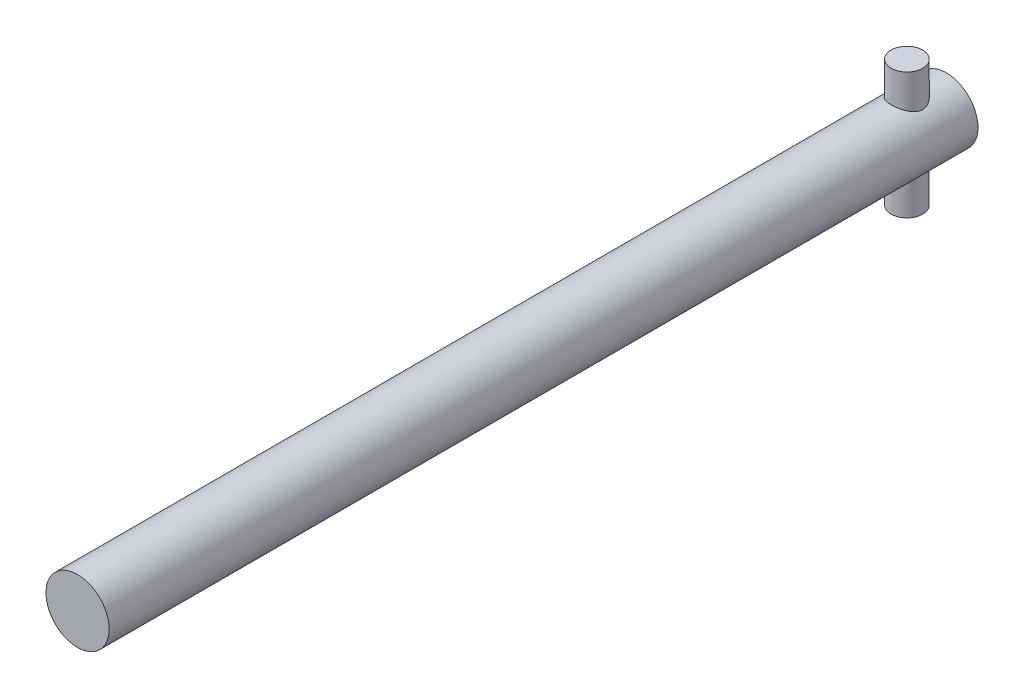
ISO-10303-21;
HEADER;
FILE_DESCRIPTION(('STEP AP214'),'2;1');
FILE_NAME('part.step','',(''),(''),'','','');
FILE_SCHEMA(('AUTOMOTIVE_DESIGN { 1 0 10303 214 1 1 1 1 }'));
ENDSEC;
DATA;
#1=APPLICATION_CONTEXT('core data for automotive mechanical design processes');
#2=APPLICATION_PROTOCOL_DEFINITION('international standard','automotive_design',2000,#1);
#3=PRODUCT_CONTEXT('',#1,'mechanical');
#4=PRODUCT('Part','Part','',(#3));
#5=PRODUCT_RELATED_PRODUCT_CATEGORY('part','',(#4));
#6=PRODUCT_DEFINITION_FORMATION('','',#4);
#7=PRODUCT_DEFINITION_CONTEXT('part definition',#1,'design');
#8=PRODUCT_DEFINITION('design','',#6,#7);
#9=PRODUCT_DEFINITION_SHAPE('','',#8);
#10=(LENGTH_UNIT() NAMED_UNIT(*) SI_UNIT(.MILLI.,.METRE.));
#11=(NAMED_UNIT(*) PLANE_ANGLE_UNIT() SI_UNIT($,.RADIAN.));
#12=(NAMED_UNIT(*) SI_UNIT($,.STERADIAN.) SOLID_ANGLE_UNIT());
#13=UNCERTAINTY_MEASURE_WITH_UNIT(LENGTH_MEASURE(1.E-05),#10,'distance_accuracy_value','');
#14=(GEOMETRIC_REPRESENTATION_CONTEXT(3) GLOBAL_UNCERTAINTY_ASSIGNED_CONTEXT((#13)) GLOBAL_UNIT_ASSIGNED_CONTEXT((#10,
#11,#12)) REPRESENTATION_CONTEXT('',''));
#15=CARTESIAN_POINT('',(0.,0.,0.));
#16=DIRECTION('',(0.,0.,1.));
#17=DIRECTION('',(1.,0.,0.));
#18=AXIS2_PLACEMENT_3D('',#15,#16,#17);
#19=CARTESIAN_POINT('',(0.,0.,110.));
#20=DIRECTION('',(0.,0.,-1.));
#21=DIRECTION('',(-1.,0.,0.));
#22=AXIS2_PLACEMENT_3D('',#19,#20,#21);
#23=CYLINDRICAL_SURFACE('',#22,4.);
#24=CARTESIAN_POINT('',(0.,-4.,7.00000000000001));
#25=CARTESIAN_POINT('',(0.105143925902467,-3.99999426810082,6.99999339536562));
#26=CARTESIAN_POINT('',(0.210413199395125,-3.99580982039513,6.99165985375789));
#27=CARTESIAN_POINT('',(0.417840470537792,-3.97948312074314,6.95869423931693));
#28=CARTESIAN_POINT('',(0.519992173427259,-3.96732575657839,6.93403121400437));
#29=CARTESIAN_POINT('',(0.717867089760898,-3.93632558806751,6.86961238276675));
#30=CARTESIAN_POINT('',(0.813613605878293,-3.91750878355075,6.82991523150407));
#31=CARTESIAN_POINT('',(0.996945233613198,-3.87491553031523,6.73685875727004));
#32=CARTESIAN_POINT('',(1.08453098798012,-3.8511394726705,6.68350051150228));
#33=CARTESIAN_POINT('',(1.25501563552382,-3.79912516516124,6.56096550102943));
#34=CARTESIAN_POINT('',(1.33731042224422,-3.77070398255074,6.49102704152073));
#35=CARTESIAN_POINT('',(1.48955888973396,-3.71319940493486,6.33895704150593));
#36=CARTESIAN_POINT('',(1.55950316621354,-3.68411552418069,6.25681629645512));
#37=CARTESIAN_POINT('',(1.69050400090056,-3.62597902394695,6.07503330095324));
#38=CARTESIAN_POINT('',(1.75045067110328,-3.59710373940264,5.97452780330818));
#39=CARTESIAN_POINT('',(1.85233645378139,-3.54571957544641,5.76326532802758));
#40=CARTESIAN_POINT('',(1.89428842993267,-3.52320615213979,5.65251574255451));
#41=CARTESIAN_POINT('',(1.95626488437718,-3.48915734075617,5.43066978915616));
#42=CARTESIAN_POINT('',(1.97745171416088,-3.47704543167427,5.31999109586522));
#43=CARTESIAN_POINT('',(2.00085398661769,-3.46363779897055,5.09604232444105));
#44=CARTESIAN_POINT('',(2.00308817674615,-3.46233138686576,4.98277491825769));
#45=CARTESIAN_POINT('',(1.98937457434459,-3.47021860514497,4.77142795136927));
#46=CARTESIAN_POINT('',(1.97556911907364,-3.47817527324027,4.6731519375539));
#47=CARTESIAN_POINT('',(1.93387969811387,-3.501524574677,4.48055618125392));
#48=CARTESIAN_POINT('',(1.90599124779531,-3.51691957663553,4.38623770938937));
#49=CARTESIAN_POINT('',(1.83641956077201,-3.55374952825482,4.20154173486869));
#50=CARTESIAN_POINT('',(1.79443013423199,-3.57531681327997,4.11130720242843));
#51=CARTESIAN_POINT('',(1.69808337533601,-3.62206808562807,3.93873141481999));
#52=CARTESIAN_POINT('',(1.64372048762494,-3.64725369560381,3.85639372879983));
#53=CARTESIAN_POINT('',(1.51613210982558,-3.70226315806571,3.69095749451355));
#54=CARTESIAN_POINT('',(1.44138891673857,-3.73227020473492,3.60908625284769));
#55=CARTESIAN_POINT('',(1.27911115748275,-3.79095246600814,3.4585291628182));
#56=CARTESIAN_POINT('',(1.19157051314857,-3.81962703917602,3.38984961593224));
#57=CARTESIAN_POINT('',(1.0010330116637,-3.87403974565928,3.26462867794055));
#58=CARTESIAN_POINT('',(0.897507183198819,-3.89957968324014,3.20879905510852));
#59=CARTESIAN_POINT('',(0.680932430977595,-3.94315762242485,3.11580594191398));
#60=CARTESIAN_POINT('',(0.567891152530553,-3.96120157887106,3.07862762996967));
#61=CARTESIAN_POINT('',(0.345532983321405,-3.98648667482871,3.02704919256665));
#62=CARTESIAN_POINT('',(0.236683061096653,-3.9944987660262,3.01101752850644));
#63=CARTESIAN_POINT('',(0.0175591998987042,-4.00146026918207,2.99707053773103));
#64=CARTESIAN_POINT('',(-0.0927140397398168,-4.00041397442637,2.99914662872107));
#65=CARTESIAN_POINT('',(-0.302465943971973,-3.9898238450687,3.02041337683749));
#66=CARTESIAN_POINT('',(-0.40211881609986,-3.98094491376337,3.03826506545999));
#67=CARTESIAN_POINT('',(-0.596813784603882,-3.9564434262968,3.08847614379025));
#68=CARTESIAN_POINT('',(-0.691855371382174,-3.94082012668824,3.12083713290699));
#69=CARTESIAN_POINT('',(-0.877777216899146,-3.90368502827176,3.19999693286607));
#70=CARTESIAN_POINT('',(-0.968460794011607,-3.88201763539261,3.24718210023258));
#71=CARTESIAN_POINT('',(-1.14092272339854,-3.83487948634835,3.35421507129314));
#72=CARTESIAN_POINT('',(-1.22269725955318,-3.80940711133877,3.41406826919079));
#73=CARTESIAN_POINT('',(-1.38353537857843,-3.75416442672396,3.55152085066144));
#74=CARTESIAN_POINT('',(-1.46154415563805,-3.72421769686998,3.6302857368903));
#75=CARTESIAN_POINT('',(-1.60371264223771,-3.6652478321764,3.79985030255546));
#76=CARTESIAN_POINT('',(-1.66786277142375,-3.63622534800094,3.89065823769584));
#77=CARTESIAN_POINT('',(-1.78341582895804,-3.58102384412979,4.08728730834595));
#78=CARTESIAN_POINT('',(-1.8340509916005,-3.55505059178121,4.19362253218897));
#79=CARTESIAN_POINT('',(-1.91616565186941,-3.51148144588269,4.41502013514993));
#80=CARTESIAN_POINT('',(-1.94766983173403,-3.493874764435,4.53007105293378));
#81=CARTESIAN_POINT('',(-1.98772337493375,-3.47123002051604,4.75382044576941));
#82=CARTESIAN_POINT('',(-1.99818599281091,-3.4651476693013,4.86206850687049));
#83=CARTESIAN_POINT('',(-2.00137830875241,-3.46330709283206,5.07889413432905));
#84=CARTESIAN_POINT('',(-1.99411569324649,-3.4675443925278,5.18747153747573));
#85=CARTESIAN_POINT('',(-1.96385225118662,-3.48475724102153,5.39096700306688));
#86=CARTESIAN_POINT('',(-1.94241662868607,-3.49686188965317,5.48620094028948));
#87=CARTESIAN_POINT('',(-1.88635071644882,-3.52742032375305,5.67161623884874));
#88=CARTESIAN_POINT('',(-1.85171618231984,-3.54587615139337,5.76179596418407));
#89=CARTESIAN_POINT('',(-1.76763149060113,-3.58857060729071,5.94124970197308));
#90=CARTESIAN_POINT('',(-1.7173422756314,-3.61311444791841,6.03005580365806));
#91=CARTESIAN_POINT('',(-1.60430194327479,-3.66470663269721,6.19854907236252));
#92=CARTESIAN_POINT('',(-1.54154434248312,-3.69175627591221,6.27823146104223));
#93=CARTESIAN_POINT('',(-1.39640665332275,-3.74924646316184,6.43628396470936));
#94=CARTESIAN_POINT('',(-1.31256884599452,-3.77969966613256,6.51331820470059));
#95=CARTESIAN_POINT('',(-1.1323096124664,-3.83755504519861,6.65252596687055));
#96=CARTESIAN_POINT('',(-1.0358814466104,-3.8649555725239,6.71469147893982));
#97=CARTESIAN_POINT('',(-0.831863193565893,-3.91396019133075,6.82247272542415));
#98=CARTESIAN_POINT('',(-0.724199007553463,-3.93552192987866,6.86796833847294));
#99=CARTESIAN_POINT('',(-0.501484202276175,-3.97002682597974,6.93961633551482));
#100=CARTESIAN_POINT('',(-0.386455599178201,-3.98299446726136,6.96582369361143));
#101=CARTESIAN_POINT('',(-0.225203892981791,-3.99390923826956,6.98779482217149));
#102=CARTESIAN_POINT('',(-0.18032375888313,-3.99618730680502,6.99236528173269));
#103=CARTESIAN_POINT('',(-0.0903034636101834,-3.99923393953631,6.99846933102817));
#104=CARTESIAN_POINT('',(-0.045163295293257,-4.00000246206762,7.00000283694042));
#105=CARTESIAN_POINT('',(0.,-4.,7.00000000000001));
#106=B_SPLINE_CURVE_WITH_KNOTS('',3,(#24,#25,#26,#27,#28,#29,#30,#31,#32,#33,#34,#35,#36,#37,
#38,#39,#40,#41,#42,#43,#44,#45,#46,#47,#48,#49,#50,#51,#52,#53,#54,#55,#56,#57,#58,#59,#60,#61,
#62,#63,#64,#65,#66,#67,#68,#69,#70,#71,#72,#73,#74,#75,#76,#77,#78,#79,#80,#81,#82,#83,#84,#85,
#86,#87,#88,#89,#90,#91,#92,#93,#94,#95,#96,#97,#98,#99,#100,#101,#102,#103,#104,#105),
.UNSPECIFIED.,.T.,.F.,(4,2,2,2,2,2,2,2,2,2,2,2,2,2,2,2,2,2,2,2,2,2,2,2,2,2,2,2,2,2,2,2,2,2,2,2,
2,2,2,2,4),(0.,0.315248514840585,0.631096299418396,0.945724310984597,1.26032752116314,
1.59396351743618,1.92785247530807,2.28763452861505,2.64715895796562,2.98516024280459,
3.32282714658041,3.62011424818641,3.91749607851357,4.22180480336975,4.52625042520444,
4.86929882667757,5.21251069197373,5.57166044428882,5.93052433824559,6.25966580942692,
6.58865129022952,6.89213813012244,7.19565843261863,7.50785712055798,7.82018901496679,
8.16319221288838,8.50643177230864,8.86629364323452,9.22569023890902,9.55058615006093,
9.87534119729357,10.1691586049771,10.463070575767,10.7767291356058,11.0905512228726,
11.4425048551434,11.7946476676249,12.1492802732705,12.502898172423,12.6383056026783,
12.7737167702213),.UNSPECIFIED.);
#107=CARTESIAN_POINT('',(0.,-4.,7.00000000000001));
#108=VERTEX_POINT('',#107);
#109=EDGE_CURVE('E46',#108,#108,#106,.T.);
#110=ORIENTED_EDGE('',*,*,#109,.T.);
#111=EDGE_LOOP('',(#110));
#112=FACE_BOUND('',#111,.T.);
#113=CARTESIAN_POINT('',(0.,4.,7.00000000000001));
#114=CARTESIAN_POINT('',(-0.105143925902467,3.99999426810082,6.99999339536562));
#115=CARTESIAN_POINT('',(-0.210413199395125,3.99580982039513,6.99165985375789));
#116=CARTESIAN_POINT('',(-0.417840470537792,3.97948312074314,6.95869423931693));
#117=CARTESIAN_POINT('',(-0.519992173427259,3.96732575657839,6.93403121400437));
#118=CARTESIAN_POINT('',(-0.717867089760898,3.93632558806751,6.86961238276675));
#119=CARTESIAN_POINT('',(-0.813613605878293,3.91750878355075,6.82991523150407));
#120=CARTESIAN_POINT('',(-0.996945233613198,3.87491553031523,6.73685875727004));
#121=CARTESIAN_POINT('',(-1.08453098798012,3.8511394726705,6.68350051150228));
#122=CARTESIAN_POINT('',(-1.25501563552382,3.79912516516124,6.56096550102943));
#123=CARTESIAN_POINT('',(-1.33731042224422,3.77070398255074,6.49102704152073));
#124=CARTESIAN_POINT('',(-1.48955888973396,3.71319940493486,6.33895704150593));
#125=CARTESIAN_POINT('',(-1.55950316621354,3.68411552418069,6.25681629645512));
#126=CARTESIAN_POINT('',(-1.69050400090056,3.62597902394695,6.07503330095324));
#127=CARTESIAN_POINT('',(-1.75045067110328,3.59710373940264,5.97452780330818));
#128=CARTESIAN_POINT('',(-1.85233645378139,3.54571957544641,5.76326532802758));
#129=CARTESIAN_POINT('',(-1.89428842993267,3.52320615213979,5.65251574255451));
#130=CARTESIAN_POINT('',(-1.95626488437718,3.48915734075617,5.43066978915616));
#131=CARTESIAN_POINT('',(-1.97745171416088,3.47704543167427,5.31999109586522));
#132=CARTESIAN_POINT('',(-2.00085398661769,3.46363779897055,5.09604232444105));
#133=CARTESIAN_POINT('',(-2.00308817674615,3.46233138686576,4.98277491825769));
#134=CARTESIAN_POINT('',(-1.98937457434459,3.47021860514497,4.77142795136927));
#135=CARTESIAN_POINT('',(-1.97556911907364,3.47817527324027,4.6731519375539));
#136=CARTESIAN_POINT('',(-1.93387969811387,3.501524574677,4.48055618125392));
#137=CARTESIAN_POINT('',(-1.90599124779531,3.51691957663553,4.38623770938937));
#138=CARTESIAN_POINT('',(-1.83641956077201,3.55374952825482,4.20154173486869));
#139=CARTESIAN_POINT('',(-1.79443013423199,3.57531681327997,4.11130720242843));
#140=CARTESIAN_POINT('',(-1.69808337533601,3.62206808562807,3.93873141481999));
#141=CARTESIAN_POINT('',(-1.64372048762494,3.64725369560381,3.85639372879983));
#142=CARTESIAN_POINT('',(-1.51613210982558,3.70226315806571,3.69095749451355));
#143=CARTESIAN_POINT('',(-1.44138891673857,3.73227020473492,3.60908625284769));
#144=CARTESIAN_POINT('',(-1.27911115748275,3.79095246600814,3.4585291628182));
#145=CARTESIAN_POINT('',(-1.19157051314857,3.81962703917602,3.38984961593224));
#146=CARTESIAN_POINT('',(-1.0010330116637,3.87403974565928,3.26462867794055));
#147=CARTESIAN_POINT('',(-0.897507183198819,3.89957968324014,3.20879905510852));
#148=CARTESIAN_POINT('',(-0.680932430977595,3.94315762242485,3.11580594191398));
#149=CARTESIAN_POINT('',(-0.567891152530553,3.96120157887106,3.07862762996967));
#150=CARTESIAN_POINT('',(-0.345532983321405,3.98648667482871,3.02704919256665));
#151=CARTESIAN_POINT('',(-0.236683061096653,3.9944987660262,3.01101752850644));
#152=CARTESIAN_POINT('',(-0.0175591998987042,4.00146026918207,2.99707053773103));
#153=CARTESIAN_POINT('',(0.0927140397398168,4.00041397442637,2.99914662872107));
#154=CARTESIAN_POINT('',(0.302465943971973,3.9898238450687,3.02041337683749));
#155=CARTESIAN_POINT('',(0.40211881609986,3.98094491376337,3.03826506545999));
#156=CARTESIAN_POINT('',(0.596813784603882,3.9564434262968,3.08847614379025));
#157=CARTESIAN_POINT('',(0.691855371382174,3.94082012668824,3.12083713290699));
#158=CARTESIAN_POINT('',(0.877777216899146,3.90368502827176,3.19999693286607));
#159=CARTESIAN_POINT('',(0.968460794011607,3.88201763539261,3.24718210023258));
#160=CARTESIAN_POINT('',(1.14092272339854,3.83487948634835,3.35421507129314));
#161=CARTESIAN_POINT('',(1.22269725955318,3.80940711133877,3.41406826919079));
#162=CARTESIAN_POINT('',(1.38353537857843,3.75416442672396,3.55152085066144));
#163=CARTESIAN_POINT('',(1.46154415563805,3.72421769686998,3.6302857368903));
#164=CARTESIAN_POINT('',(1.60371264223771,3.6652478321764,3.79985030255546));
#165=CARTESIAN_POINT('',(1.66786277142375,3.63622534800094,3.89065823769584));
#166=CARTESIAN_POINT('',(1.78341582895804,3.58102384412979,4.08728730834595));
#167=CARTESIAN_POINT('',(1.8340509916005,3.55505059178121,4.19362253218897));
#168=CARTESIAN_POINT('',(1.91616565186941,3.51148144588269,4.41502013514993));
#169=CARTESIAN_POINT('',(1.94766983173403,3.493874764435,4.53007105293378));
#170=CARTESIAN_POINT('',(1.98772337493375,3.47123002051604,4.75382044576941));
#171=CARTESIAN_POINT('',(1.99818599281091,3.4651476693013,4.86206850687049));
#172=CARTESIAN_POINT('',(2.00137830875241,3.46330709283206,5.07889413432905));
#173=CARTESIAN_POINT('',(1.99411569324649,3.4675443925278,5.18747153747573));
#174=CARTESIAN_POINT('',(1.96385225118662,3.48475724102153,5.39096700306688));
#175=CARTESIAN_POINT('',(1.94241662868607,3.49686188965317,5.48620094028948));
#176=CARTESIAN_POINT('',(1.88635071644882,3.52742032375305,5.67161623884874));
#177=CARTESIAN_POINT('',(1.85171618231984,3.54587615139337,5.76179596418407));
#178=CARTESIAN_POINT('',(1.76763149060113,3.58857060729071,5.94124970197308));
#179=CARTESIAN_POINT('',(1.7173422756314,3.61311444791841,6.03005580365806));
#180=CARTESIAN_POINT('',(1.60430194327479,3.66470663269721,6.19854907236252));
#181=CARTESIAN_POINT('',(1.54154434248312,3.69175627591221,6.27823146104223));
#182=CARTESIAN_POINT('',(1.39640665332275,3.74924646316184,6.43628396470936));
#183=CARTESIAN_POINT('',(1.31256884599452,3.77969966613256,6.51331820470059));
#184=CARTESIAN_POINT('',(1.1323096124664,3.83755504519861,6.65252596687055));
#185=CARTESIAN_POINT('',(1.0358814466104,3.8649555725239,6.71469147893982));
#186=CARTESIAN_POINT('',(0.831863193565893,3.91396019133075,6.82247272542415));
#187=CARTESIAN_POINT('',(0.724199007553463,3.93552192987866,6.86796833847294));
#188=CARTESIAN_POINT('',(0.501484202276175,3.97002682597974,6.93961633551482));
#189=CARTESIAN_POINT('',(0.386455599178201,3.98299446726136,6.96582369361143));
#190=CARTESIAN_POINT('',(0.225203892981791,3.99390923826956,6.98779482217149));
#191=CARTESIAN_POINT('',(0.18032375888313,3.99618730680502,6.99236528173269));
#192=CARTESIAN_POINT('',(0.0903034636101834,3.99923393953631,6.99846933102817));
#193=CARTESIAN_POINT('',(0.045163295293257,4.00000246206762,7.00000283694042));
#194=CARTESIAN_POINT('',(0.,4.,7.00000000000001));
#195=B_SPLINE_CURVE_WITH_KNOTS('',3,(#113,#114,#115,#116,#117,#118,#119,#120,#121,#122,#123,
#124,#125,#126,#127,#128,#129,#130,#131,#132,#133,#134,#135,#136,#137,#138,#139,#140,#141,#142,
#143,#144,#145,#146,#147,#148,#149,#150,#151,#152,#153,#154,#155,#156,#157,#158,#159,#160,#161,
#162,#163,#164,#165,#166,#167,#168,#169,#170,#171,#172,#173,#174,#175,#176,#177,#178,#179,#180,
#181,#182,#183,#184,#185,#186,#187,#188,#189,#190,#191,#192,#193,#194),.UNSPECIFIED.,.T.,.F.,(4,
2,2,2,2,2,2,2,2,2,2,2,2,2,2,2,2,2,2,2,2,2,2,2,2,2,2,2,2,2,2,2,2,2,2,2,2,2,2,2,4),(0.,
0.315248514840585,0.631096299418396,0.945724310984597,1.26032752116314,1.59396351743618,
1.92785247530807,2.28763452861505,2.64715895796562,2.98516024280459,3.32282714658041,
3.62011424818641,3.91749607851357,4.22180480336975,4.52625042520444,4.86929882667757,
5.21251069197373,5.57166044428882,5.93052433824559,6.25966580942692,6.58865129022952,
6.89213813012244,7.19565843261863,7.50785712055798,7.82018901496679,8.16319221288838,
8.50643177230864,8.86629364323452,9.22569023890902,9.55058615006093,9.87534119729357,
10.1691586049771,10.463070575767,10.7767291356058,11.0905512228726,11.4425048551434,
11.7946476676249,12.1492802732705,12.502898172423,12.6383056026783,12.7737167702213),.UNSPECIFIED.);
#196=CARTESIAN_POINT('',(0.,4.,7.00000000000001));
#197=VERTEX_POINT('',#196);
#198=EDGE_CURVE('E63',#197,#197,#195,.T.);
#199=ORIENTED_EDGE('',*,*,#198,.T.);
#200=EDGE_LOOP('',(#199));
#201=FACE_BOUND('',#200,.T.);
#202=CARTESIAN_POINT('',(0.,0.,110.));
#203=DIRECTION('',(0.,0.,1.));
#204=DIRECTION('',(1.,0.,0.));
#205=AXIS2_PLACEMENT_3D('',#202,#203,#204);
#206=CIRCLE('',#205,4.);
#207=CARTESIAN_POINT('',(4.,0.,110.));
#208=VERTEX_POINT('',#207);
#209=EDGE_CURVE('E12',#208,#208,#206,.T.);
#210=ORIENTED_EDGE('',*,*,#209,.F.);
#211=EDGE_LOOP('',(#210));
#212=FACE_BOUND('',#211,.T.);
#213=CARTESIAN_POINT('',(0.,0.,0.));
#214=DIRECTION('',(0.,0.,1.));
#215=DIRECTION('',(1.,0.,0.));
#216=AXIS2_PLACEMENT_3D('',#213,#214,#215);
#217=CIRCLE('',#216,4.);
#218=CARTESIAN_POINT('',(4.,0.,0.));
#219=VERTEX_POINT('',#218);
#220=EDGE_CURVE('E54',#219,#219,#217,.T.);
#221=ORIENTED_EDGE('',*,*,#220,.T.);
#222=EDGE_LOOP('',(#221));
#223=FACE_BOUND('',#222,.T.);
#224=ADVANCED_FACE('F42',(#112,#201,#212,#223),#23,.T.);
#225=CARTESIAN_POINT('',(0.,0.,110.));
#226=DIRECTION('',(0.,0.,1.));
#227=DIRECTION('',(1.,0.,0.));
#228=AXIS2_PLACEMENT_3D('',#225,#226,#227);
#229=PLANE('',#228);
#230=ORIENTED_EDGE('',*,*,#209,.T.);
#231=EDGE_LOOP('',(#230));
#232=FACE_BOUND('',#231,.T.);
#233=ADVANCED_FACE('F77',(#232),#229,.T.);
#234=CARTESIAN_POINT('',(0.,0.,0.));
#235=DIRECTION('',(0.,0.,1.));
#236=DIRECTION('',(1.,0.,0.));
#237=AXIS2_PLACEMENT_3D('',#234,#235,#236);
#238=PLANE('',#237);
#239=ORIENTED_EDGE('',*,*,#220,.F.);
#240=EDGE_LOOP('',(#239));
#241=FACE_BOUND('',#240,.T.);
#242=ADVANCED_FACE('F80',(#241),#238,.F.);
#243=CARTESIAN_POINT('',(0.,8.,5.));
#244=DIRECTION('',(0.,1.,0.));
#245=DIRECTION('',(0.,0.,1.));
#246=AXIS2_PLACEMENT_3D('',#243,#244,#245);
#247=PLANE('',#246);
#248=CARTESIAN_POINT('',(0.,8.,5.));
#249=DIRECTION('',(0.,1.,0.));
#250=DIRECTION('',(0.,0.,1.));
#251=AXIS2_PLACEMENT_3D('',#248,#249,#250);
#252=CIRCLE('',#251,2.);
#253=CARTESIAN_POINT('',(0.,8.,7.00000000000001));
#254=VERTEX_POINT('',#253);
#255=EDGE_CURVE('E106',#254,#254,#252,.T.);
#256=ORIENTED_EDGE('',*,*,#255,.T.);
#257=EDGE_LOOP('',(#256));
#258=FACE_BOUND('',#257,.T.);
#259=ADVANCED_FACE('F82',(#258),#247,.T.);
#260=CARTESIAN_POINT('',(0.,-8.,5.));
#261=DIRECTION('',(0.,1.,0.));
#262=DIRECTION('',(0.,0.,1.));
#263=AXIS2_PLACEMENT_3D('',#260,#261,#262);
#264=CYLINDRICAL_SURFACE('',#263,2.);
#265=ORIENTED_EDGE('',*,*,#255,.F.);
#266=EDGE_LOOP('',(#265));
#267=FACE_BOUND('',#266,.T.);
#268=ORIENTED_EDGE('',*,*,#198,.F.);
#269=EDGE_LOOP('',(#268));
#270=FACE_BOUND('',#269,.T.);
#271=ADVANCED_FACE('F74',(#267,#270),#264,.T.);
#272=CARTESIAN_POINT('',(0.,-8.,5.));
#273=DIRECTION('',(0.,1.,0.));
#274=DIRECTION('',(0.,0.,1.));
#275=AXIS2_PLACEMENT_3D('',#272,#273,#274);
#276=CIRCLE('',#275,2.);
#277=CARTESIAN_POINT('',(0.,-8.,7.00000000000001));
#278=VERTEX_POINT('',#277);
#279=EDGE_CURVE('E61',#278,#278,#276,.T.);
#280=ORIENTED_EDGE('',*,*,#279,.T.);
#281=EDGE_LOOP('',(#280));
#282=FACE_BOUND('',#281,.T.);
#283=ORIENTED_EDGE('',*,*,#109,.F.);
#284=EDGE_LOOP('',(#283));
#285=FACE_BOUND('',#284,.T.);
#286=ADVANCED_FACE('F68',(#282,#285),#264,.T.);
#287=CARTESIAN_POINT('',(0.,-8.,5.));
#288=DIRECTION('',(0.,1.,0.));
#289=DIRECTION('',(0.,0.,1.));
#290=AXIS2_PLACEMENT_3D('',#287,#288,#289);
#291=PLANE('',#290);
#292=ORIENTED_EDGE('',*,*,#279,.F.);
#293=EDGE_LOOP('',(#292));
#294=FACE_BOUND('',#293,.T.);
#295=ADVANCED_FACE('F73',(#294),#291,.F.);
#296=CLOSED_SHELL('',(#224,#233,#242,#259,#271,#286,#295));
#297=MANIFOLD_SOLID_BREP('B2',#296);
#298=ADVANCED_BREP_SHAPE_REPRESENTATION('',(#18,#297),#14);
#299=SHAPE_DEFINITION_REPRESENTATION(#9,#298);
ENDSEC;
END-ISO-10303-21;
